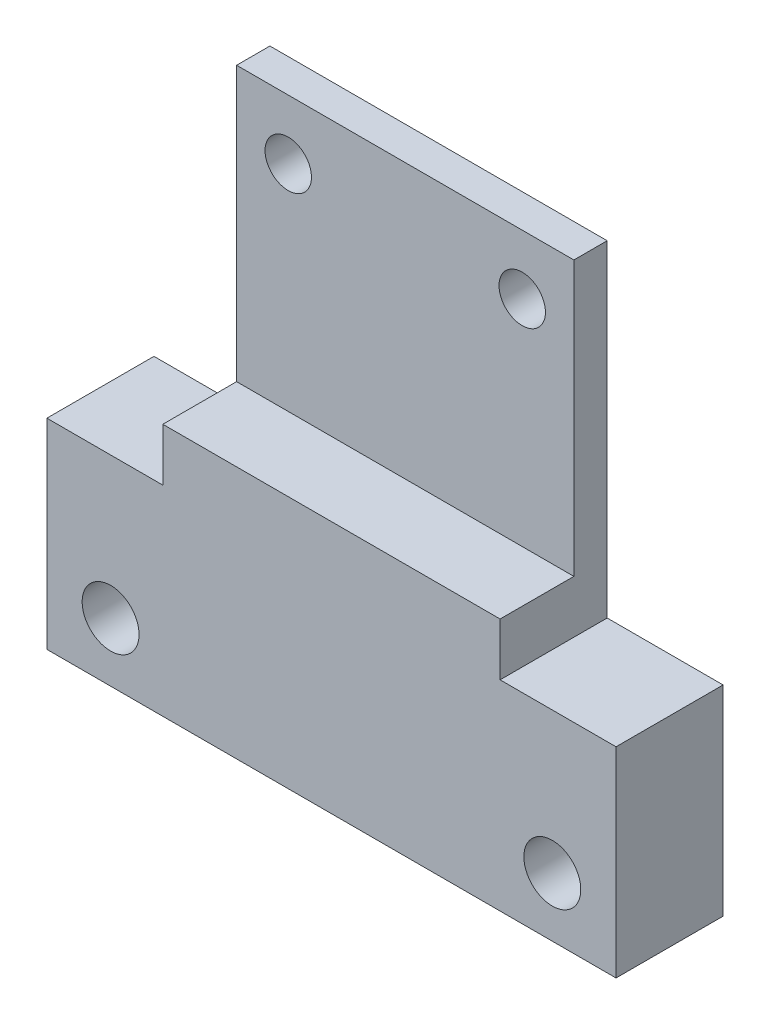
ISO-10303-21;
HEADER;
FILE_DESCRIPTION(('STEP AP214'),'2;1');
FILE_NAME('part.step','',(''),(''),'','','');
FILE_SCHEMA(('AUTOMOTIVE_DESIGN { 1 0 10303 214 1 1 1 1 }'));
ENDSEC;
DATA;
#1=APPLICATION_CONTEXT('core data for automotive mechanical design processes');
#2=APPLICATION_PROTOCOL_DEFINITION('international standard','automotive_design',2000,#1);
#3=PRODUCT_CONTEXT('',#1,'mechanical');
#4=PRODUCT('Part','Part','',(#3));
#5=PRODUCT_RELATED_PRODUCT_CATEGORY('part','',(#4));
#6=PRODUCT_DEFINITION_FORMATION('','',#4);
#7=PRODUCT_DEFINITION_CONTEXT('part definition',#1,'design');
#8=PRODUCT_DEFINITION('design','',#6,#7);
#9=PRODUCT_DEFINITION_SHAPE('','',#8);
#10=(LENGTH_UNIT() NAMED_UNIT(*) SI_UNIT(.MILLI.,.METRE.));
#11=(NAMED_UNIT(*) PLANE_ANGLE_UNIT() SI_UNIT($,.RADIAN.));
#12=(NAMED_UNIT(*) SI_UNIT($,.STERADIAN.) SOLID_ANGLE_UNIT());
#13=UNCERTAINTY_MEASURE_WITH_UNIT(LENGTH_MEASURE(1.E-05),#10,'distance_accuracy_value','');
#14=(GEOMETRIC_REPRESENTATION_CONTEXT(3) GLOBAL_UNCERTAINTY_ASSIGNED_CONTEXT((#13)) GLOBAL_UNIT_ASSIGNED_CONTEXT((#10,
#11,#12)) REPRESENTATION_CONTEXT('',''));
#15=CARTESIAN_POINT('',(0.,0.,0.));
#16=DIRECTION('',(0.,0.,1.));
#17=DIRECTION('',(1.,0.,0.));
#18=AXIS2_PLACEMENT_3D('',#15,#16,#17);
#19=CARTESIAN_POINT('',(5.5,25.,5.08));
#20=DIRECTION('',(0.,-1.,0.));
#21=DIRECTION('',(0.,0.,-1.));
#22=AXIS2_PLACEMENT_3D('',#19,#20,#21);
#23=PLANE('',#22);
#24=DIRECTION('',(-1.,0.,0.));
#25=VECTOR('',#24,1.);
#26=CARTESIAN_POINT('',(5.5,25.,1.58));
#27=LINE('',#26,#25);
#28=CARTESIAN_POINT('',(21.5,25.,1.58));
#29=VERTEX_POINT('',#28);
#30=CARTESIAN_POINT('',(5.5,25.,1.58));
#31=VERTEX_POINT('',#30);
#32=EDGE_CURVE('E218',#29,#31,#27,.T.);
#33=ORIENTED_EDGE('',*,*,#32,.F.);
#34=DIRECTION('',(0.,0.,-1.));
#35=VECTOR('',#34,1.);
#36=CARTESIAN_POINT('',(21.5,25.,5.08));
#37=LINE('',#36,#35);
#38=CARTESIAN_POINT('',(21.5,25.,0.));
#39=VERTEX_POINT('',#38);
#40=EDGE_CURVE('E131',#29,#39,#37,.T.);
#41=ORIENTED_EDGE('',*,*,#40,.T.);
#42=DIRECTION('',(-1.,0.,0.));
#43=VECTOR('',#42,1.);
#44=CARTESIAN_POINT('',(5.5,25.,0.));
#45=LINE('',#44,#43);
#46=CARTESIAN_POINT('',(5.5,25.,0.));
#47=VERTEX_POINT('',#46);
#48=EDGE_CURVE('E155',#39,#47,#45,.T.);
#49=ORIENTED_EDGE('',*,*,#48,.T.);
#50=DIRECTION('',(0.,0.,-1.));
#51=VECTOR('',#50,1.);
#52=CARTESIAN_POINT('',(5.5,25.,5.08));
#53=LINE('',#52,#51);
#54=EDGE_CURVE('E165',#31,#47,#53,.T.);
#55=ORIENTED_EDGE('',*,*,#54,.F.);
#56=EDGE_LOOP('',(#33,#41,#49,#55));
#57=FACE_BOUND('',#56,.T.);
#58=ADVANCED_FACE('F33',(#57),#23,.F.);
#59=CARTESIAN_POINT('',(0.,0.,5.08));
#60=DIRECTION('',(1.,0.,0.));
#61=DIRECTION('',(0.,0.,-1.));
#62=AXIS2_PLACEMENT_3D('',#59,#60,#61);
#63=PLANE('',#62);
#64=DIRECTION('',(0.,-1.,0.));
#65=VECTOR('',#64,1.);
#66=CARTESIAN_POINT('',(0.,0.,0.));
#67=LINE('',#66,#65);
#68=CARTESIAN_POINT('',(0.,9.5,0.));
#69=VERTEX_POINT('',#68);
#70=CARTESIAN_POINT('',(0.,0.,0.));
#71=VERTEX_POINT('',#70);
#72=EDGE_CURVE('E145',#69,#71,#67,.T.);
#73=ORIENTED_EDGE('',*,*,#72,.T.);
#74=DIRECTION('',(0.,0.,-1.));
#75=VECTOR('',#74,1.);
#76=CARTESIAN_POINT('',(0.,0.,5.08));
#77=LINE('',#76,#75);
#78=CARTESIAN_POINT('',(0.,0.,5.08));
#79=VERTEX_POINT('',#78);
#80=EDGE_CURVE('E11',#79,#71,#77,.T.);
#81=ORIENTED_EDGE('',*,*,#80,.F.);
#82=DIRECTION('',(0.,-1.,0.));
#83=VECTOR('',#82,1.);
#84=CARTESIAN_POINT('',(0.,0.,5.08));
#85=LINE('',#84,#83);
#86=CARTESIAN_POINT('',(0.,9.5,5.08));
#87=VERTEX_POINT('',#86);
#88=EDGE_CURVE('E161',#87,#79,#85,.T.);
#89=ORIENTED_EDGE('',*,*,#88,.F.);
#90=DIRECTION('',(0.,0.,-1.));
#91=VECTOR('',#90,1.);
#92=CARTESIAN_POINT('',(0.,9.5,5.08));
#93=LINE('',#92,#91);
#94=EDGE_CURVE('E144',#87,#69,#93,.T.);
#95=ORIENTED_EDGE('',*,*,#94,.T.);
#96=EDGE_LOOP('',(#73,#81,#89,#95));
#97=FACE_BOUND('',#96,.T.);
#98=ADVANCED_FACE('F35',(#97),#63,.F.);
#99=CARTESIAN_POINT('',(0.,0.,5.08));
#100=DIRECTION('',(0.,1.,0.));
#101=DIRECTION('',(0.,0.,1.));
#102=AXIS2_PLACEMENT_3D('',#99,#100,#101);
#103=PLANE('',#102);
#104=DIRECTION('',(1.,0.,0.));
#105=VECTOR('',#104,1.);
#106=CARTESIAN_POINT('',(0.,0.,0.));
#107=LINE('',#106,#105);
#108=CARTESIAN_POINT('',(27.,0.,0.));
#109=VERTEX_POINT('',#108);
#110=EDGE_CURVE('E148',#71,#109,#107,.T.);
#111=ORIENTED_EDGE('',*,*,#110,.T.);
#112=DIRECTION('',(0.,0.,-1.));
#113=VECTOR('',#112,1.);
#114=CARTESIAN_POINT('',(27.,0.,5.08));
#115=LINE('',#114,#113);
#116=CARTESIAN_POINT('',(27.,0.,5.08));
#117=VERTEX_POINT('',#116);
#118=EDGE_CURVE('E42',#117,#109,#115,.T.);
#119=ORIENTED_EDGE('',*,*,#118,.F.);
#120=DIRECTION('',(1.,0.,0.));
#121=VECTOR('',#120,1.);
#122=CARTESIAN_POINT('',(0.,0.,5.08));
#123=LINE('',#122,#121);
#124=EDGE_CURVE('E100',#79,#117,#123,.T.);
#125=ORIENTED_EDGE('',*,*,#124,.F.);
#126=ORIENTED_EDGE('',*,*,#80,.T.);
#127=EDGE_LOOP('',(#111,#119,#125,#126));
#128=FACE_BOUND('',#127,.T.);
#129=ADVANCED_FACE('F227',(#128),#103,.F.);
#130=CARTESIAN_POINT('',(27.,0.,5.08));
#131=DIRECTION('',(-1.,0.,0.));
#132=DIRECTION('',(0.,0.,1.));
#133=AXIS2_PLACEMENT_3D('',#130,#131,#132);
#134=PLANE('',#133);
#135=DIRECTION('',(0.,1.,0.));
#136=VECTOR('',#135,1.);
#137=CARTESIAN_POINT('',(27.,0.,0.));
#138=LINE('',#137,#136);
#139=CARTESIAN_POINT('',(27.,9.5,0.));
#140=VERTEX_POINT('',#139);
#141=EDGE_CURVE('E150',#109,#140,#138,.T.);
#142=ORIENTED_EDGE('',*,*,#141,.T.);
#143=DIRECTION('',(0.,0.,-1.));
#144=VECTOR('',#143,1.);
#145=CARTESIAN_POINT('',(27.,9.5,5.08));
#146=LINE('',#145,#144);
#147=CARTESIAN_POINT('',(27.,9.5,5.08));
#148=VERTEX_POINT('',#147);
#149=EDGE_CURVE('E130',#148,#140,#146,.T.);
#150=ORIENTED_EDGE('',*,*,#149,.F.);
#151=DIRECTION('',(0.,1.,0.));
#152=VECTOR('',#151,1.);
#153=CARTESIAN_POINT('',(27.,0.,5.08));
#154=LINE('',#153,#152);
#155=EDGE_CURVE('E117',#117,#148,#154,.T.);
#156=ORIENTED_EDGE('',*,*,#155,.F.);
#157=ORIENTED_EDGE('',*,*,#118,.T.);
#158=EDGE_LOOP('',(#142,#150,#156,#157));
#159=FACE_BOUND('',#158,.T.);
#160=ADVANCED_FACE('F230',(#159),#134,.F.);
#161=CARTESIAN_POINT('',(21.5,9.5,5.08));
#162=DIRECTION('',(0.,-1.,0.));
#163=DIRECTION('',(0.,0.,-1.));
#164=AXIS2_PLACEMENT_3D('',#161,#162,#163);
#165=PLANE('',#164);
#166=DIRECTION('',(-1.,0.,0.));
#167=VECTOR('',#166,1.);
#168=CARTESIAN_POINT('',(21.5,9.5,0.));
#169=LINE('',#168,#167);
#170=CARTESIAN_POINT('',(21.5,9.5,0.));
#171=VERTEX_POINT('',#170);
#172=EDGE_CURVE('E126',#140,#171,#169,.T.);
#173=ORIENTED_EDGE('',*,*,#172,.T.);
#174=DIRECTION('',(0.,0.,-1.));
#175=VECTOR('',#174,1.);
#176=CARTESIAN_POINT('',(21.5,9.5,5.08));
#177=LINE('',#176,#175);
#178=CARTESIAN_POINT('',(21.5,9.5,5.08));
#179=VERTEX_POINT('',#178);
#180=EDGE_CURVE('E123',#179,#171,#177,.T.);
#181=ORIENTED_EDGE('',*,*,#180,.F.);
#182=DIRECTION('',(-1.,0.,0.));
#183=VECTOR('',#182,1.);
#184=CARTESIAN_POINT('',(21.5,9.5,5.08));
#185=LINE('',#184,#183);
#186=EDGE_CURVE('E111',#148,#179,#185,.T.);
#187=ORIENTED_EDGE('',*,*,#186,.F.);
#188=ORIENTED_EDGE('',*,*,#149,.T.);
#189=EDGE_LOOP('',(#173,#181,#187,#188));
#190=FACE_BOUND('',#189,.T.);
#191=ADVANCED_FACE('F124',(#190),#165,.F.);
#192=CARTESIAN_POINT('',(21.5,25.,5.08));
#193=DIRECTION('',(-1.,0.,0.));
#194=DIRECTION('',(0.,-1.,0.));
#195=AXIS2_PLACEMENT_3D('',#192,#193,#194);
#196=PLANE('',#195);
#197=DIRECTION('',(0.,1.,0.));
#198=VECTOR('',#197,1.);
#199=CARTESIAN_POINT('',(21.5,25.,1.58));
#200=LINE('',#199,#198);
#201=CARTESIAN_POINT('',(21.5,12.,1.58));
#202=VERTEX_POINT('',#201);
#203=EDGE_CURVE('E215',#202,#29,#200,.T.);
#204=ORIENTED_EDGE('',*,*,#203,.F.);
#205=DIRECTION('',(0.,0.,1.));
#206=VECTOR('',#205,1.);
#207=CARTESIAN_POINT('',(21.5,12.,1.58));
#208=LINE('',#207,#206);
#209=CARTESIAN_POINT('',(21.5,12.,5.08));
#210=VERTEX_POINT('',#209);
#211=EDGE_CURVE('E137',#202,#210,#208,.T.);
#212=ORIENTED_EDGE('',*,*,#211,.T.);
#213=DIRECTION('',(0.,1.,0.));
#214=VECTOR('',#213,1.);
#215=CARTESIAN_POINT('',(21.5,25.,5.08));
#216=LINE('',#215,#214);
#217=EDGE_CURVE('E115',#179,#210,#216,.T.);
#218=ORIENTED_EDGE('',*,*,#217,.F.);
#219=ORIENTED_EDGE('',*,*,#180,.T.);
#220=DIRECTION('',(0.,1.,0.));
#221=VECTOR('',#220,1.);
#222=CARTESIAN_POINT('',(21.5,25.,0.));
#223=LINE('',#222,#221);
#224=EDGE_CURVE('E153',#171,#39,#223,.T.);
#225=ORIENTED_EDGE('',*,*,#224,.T.);
#226=ORIENTED_EDGE('',*,*,#40,.F.);
#227=EDGE_LOOP('',(#204,#212,#218,#219,#225,#226));
#228=FACE_BOUND('',#227,.T.);
#229=ADVANCED_FACE('F135',(#228),#196,.F.);
#230=CARTESIAN_POINT('',(5.5,25.,5.08));
#231=DIRECTION('',(1.,0.,0.));
#232=DIRECTION('',(0.,1.,0.));
#233=AXIS2_PLACEMENT_3D('',#230,#231,#232);
#234=PLANE('',#233);
#235=DIRECTION('',(0.,-1.,0.));
#236=VECTOR('',#235,1.);
#237=CARTESIAN_POINT('',(5.5,25.,5.08));
#238=LINE('',#237,#236);
#239=CARTESIAN_POINT('',(5.5,12.,5.08));
#240=VERTEX_POINT('',#239);
#241=CARTESIAN_POINT('',(5.5,9.5,5.08));
#242=VERTEX_POINT('',#241);
#243=EDGE_CURVE('E138',#240,#242,#238,.T.);
#244=ORIENTED_EDGE('',*,*,#243,.F.);
#245=DIRECTION('',(0.,0.,1.));
#246=VECTOR('',#245,1.);
#247=CARTESIAN_POINT('',(5.5,12.,1.58));
#248=LINE('',#247,#246);
#249=CARTESIAN_POINT('',(5.5,12.,1.58));
#250=VERTEX_POINT('',#249);
#251=EDGE_CURVE('E50',#250,#240,#248,.T.);
#252=ORIENTED_EDGE('',*,*,#251,.F.);
#253=DIRECTION('',(0.,-1.,0.));
#254=VECTOR('',#253,1.);
#255=CARTESIAN_POINT('',(5.5,25.,1.58));
#256=LINE('',#255,#254);
#257=EDGE_CURVE('E209',#31,#250,#256,.T.);
#258=ORIENTED_EDGE('',*,*,#257,.F.);
#259=ORIENTED_EDGE('',*,*,#54,.T.);
#260=DIRECTION('',(0.,-1.,0.));
#261=VECTOR('',#260,1.);
#262=CARTESIAN_POINT('',(5.5,25.,0.));
#263=LINE('',#262,#261);
#264=CARTESIAN_POINT('',(5.5,9.5,0.));
#265=VERTEX_POINT('',#264);
#266=EDGE_CURVE('E158',#47,#265,#263,.T.);
#267=ORIENTED_EDGE('',*,*,#266,.T.);
#268=DIRECTION('',(0.,0.,-1.));
#269=VECTOR('',#268,1.);
#270=CARTESIAN_POINT('',(5.5,9.5,5.08));
#271=LINE('',#270,#269);
#272=EDGE_CURVE('E163',#242,#265,#271,.T.);
#273=ORIENTED_EDGE('',*,*,#272,.F.);
#274=EDGE_LOOP('',(#244,#252,#258,#259,#267,#273));
#275=FACE_BOUND('',#274,.T.);
#276=ADVANCED_FACE('F249',(#275),#234,.F.);
#277=CARTESIAN_POINT('',(0.,9.5,5.08));
#278=DIRECTION('',(0.,-1.,0.));
#279=DIRECTION('',(0.,0.,-1.));
#280=AXIS2_PLACEMENT_3D('',#277,#278,#279);
#281=PLANE('',#280);
#282=DIRECTION('',(-1.,0.,0.));
#283=VECTOR('',#282,1.);
#284=CARTESIAN_POINT('',(0.,9.5,0.));
#285=LINE('',#284,#283);
#286=EDGE_CURVE('E92',#265,#69,#285,.T.);
#287=ORIENTED_EDGE('',*,*,#286,.T.);
#288=ORIENTED_EDGE('',*,*,#94,.F.);
#289=DIRECTION('',(-1.,0.,0.));
#290=VECTOR('',#289,1.);
#291=CARTESIAN_POINT('',(0.,9.5,5.08));
#292=LINE('',#291,#290);
#293=EDGE_CURVE('E59',#242,#87,#292,.T.);
#294=ORIENTED_EDGE('',*,*,#293,.F.);
#295=ORIENTED_EDGE('',*,*,#272,.T.);
#296=EDGE_LOOP('',(#287,#288,#294,#295));
#297=FACE_BOUND('',#296,.T.);
#298=ADVANCED_FACE('F254',(#297),#281,.F.);
#299=CARTESIAN_POINT('',(0.,0.,5.08));
#300=DIRECTION('',(0.,0.,-1.));
#301=DIRECTION('',(-1.,0.,0.));
#302=AXIS2_PLACEMENT_3D('',#299,#300,#301);
#303=PLANE('',#302);
#304=CARTESIAN_POINT('',(23.9775,2.794,5.08));
#305=DIRECTION('',(0.,0.,-1.));
#306=DIRECTION('',(-1.,0.,0.));
#307=AXIS2_PLACEMENT_3D('',#304,#305,#306);
#308=CIRCLE('',#307,1.35);
#309=CARTESIAN_POINT('',(22.6275,2.794,5.08));
#310=VERTEX_POINT('',#309);
#311=EDGE_CURVE('E37',#310,#310,#308,.T.);
#312=ORIENTED_EDGE('',*,*,#311,.T.);
#313=EDGE_LOOP('',(#312));
#314=FACE_BOUND('',#313,.T.);
#315=CARTESIAN_POINT('',(3.0225,2.794,5.08));
#316=DIRECTION('',(0.,0.,-1.));
#317=DIRECTION('',(-1.,0.,0.));
#318=AXIS2_PLACEMENT_3D('',#315,#316,#317);
#319=CIRCLE('',#318,1.35);
#320=CARTESIAN_POINT('',(1.6725,2.794,5.08));
#321=VERTEX_POINT('',#320);
#322=EDGE_CURVE('E178',#321,#321,#319,.T.);
#323=ORIENTED_EDGE('',*,*,#322,.T.);
#324=EDGE_LOOP('',(#323));
#325=FACE_BOUND('',#324,.T.);
#326=ORIENTED_EDGE('',*,*,#217,.T.);
#327=DIRECTION('',(1.,0.,0.));
#328=VECTOR('',#327,1.);
#329=CARTESIAN_POINT('',(5.5,12.,5.08));
#330=LINE('',#329,#328);
#331=EDGE_CURVE('E200',#240,#210,#330,.T.);
#332=ORIENTED_EDGE('',*,*,#331,.F.);
#333=ORIENTED_EDGE('',*,*,#243,.T.);
#334=ORIENTED_EDGE('',*,*,#293,.T.);
#335=ORIENTED_EDGE('',*,*,#88,.T.);
#336=ORIENTED_EDGE('',*,*,#124,.T.);
#337=ORIENTED_EDGE('',*,*,#155,.T.);
#338=ORIENTED_EDGE('',*,*,#186,.T.);
#339=EDGE_LOOP('',(#326,#332,#333,#334,#335,#336,#337,#338));
#340=FACE_BOUND('',#339,.T.);
#341=ADVANCED_FACE('F113',(#314,#325,#340),#303,.F.);
#342=CARTESIAN_POINT('',(0.,0.,0.));
#343=DIRECTION('',(0.,0.,-1.));
#344=DIRECTION('',(-1.,0.,0.));
#345=AXIS2_PLACEMENT_3D('',#342,#343,#344);
#346=PLANE('',#345);
#347=CARTESIAN_POINT('',(19.0499,22.1742,0.));
#348=DIRECTION('',(0.,0.,-1.));
#349=DIRECTION('',(-1.,0.,0.));
#350=AXIS2_PLACEMENT_3D('',#347,#348,#349);
#351=CIRCLE('',#350,1.1);
#352=CARTESIAN_POINT('',(17.9499,22.1742,0.));
#353=VERTEX_POINT('',#352);
#354=EDGE_CURVE('E175',#353,#353,#351,.T.);
#355=ORIENTED_EDGE('',*,*,#354,.F.);
#356=EDGE_LOOP('',(#355));
#357=FACE_BOUND('',#356,.T.);
#358=CARTESIAN_POINT('',(7.9501,22.1742,0.));
#359=DIRECTION('',(0.,0.,-1.));
#360=DIRECTION('',(-1.,0.,0.));
#361=AXIS2_PLACEMENT_3D('',#358,#359,#360);
#362=CIRCLE('',#361,1.1);
#363=CARTESIAN_POINT('',(6.8501,22.1742,0.));
#364=VERTEX_POINT('',#363);
#365=EDGE_CURVE('E184',#364,#364,#362,.T.);
#366=ORIENTED_EDGE('',*,*,#365,.F.);
#367=EDGE_LOOP('',(#366));
#368=FACE_BOUND('',#367,.T.);
#369=CARTESIAN_POINT('',(23.9775,2.794,0.));
#370=DIRECTION('',(0.,0.,-1.));
#371=DIRECTION('',(-1.,0.,0.));
#372=AXIS2_PLACEMENT_3D('',#369,#370,#371);
#373=CIRCLE('',#372,2.);
#374=CARTESIAN_POINT('',(21.9775,2.794,0.));
#375=VERTEX_POINT('',#374);
#376=EDGE_CURVE('E201',#375,#375,#373,.T.);
#377=ORIENTED_EDGE('',*,*,#376,.F.);
#378=EDGE_LOOP('',(#377));
#379=FACE_BOUND('',#378,.T.);
#380=CARTESIAN_POINT('',(3.0225,2.794,0.));
#381=DIRECTION('',(0.,0.,-1.));
#382=DIRECTION('',(-1.,0.,0.));
#383=AXIS2_PLACEMENT_3D('',#380,#381,#382);
#384=CIRCLE('',#383,2.);
#385=CARTESIAN_POINT('',(1.0225,2.794,0.));
#386=VERTEX_POINT('',#385);
#387=EDGE_CURVE('E177',#386,#386,#384,.T.);
#388=ORIENTED_EDGE('',*,*,#387,.F.);
#389=EDGE_LOOP('',(#388));
#390=FACE_BOUND('',#389,.T.);
#391=ORIENTED_EDGE('',*,*,#72,.F.);
#392=ORIENTED_EDGE('',*,*,#286,.F.);
#393=ORIENTED_EDGE('',*,*,#266,.F.);
#394=ORIENTED_EDGE('',*,*,#48,.F.);
#395=ORIENTED_EDGE('',*,*,#224,.F.);
#396=ORIENTED_EDGE('',*,*,#172,.F.);
#397=ORIENTED_EDGE('',*,*,#141,.F.);
#398=ORIENTED_EDGE('',*,*,#110,.F.);
#399=EDGE_LOOP('',(#391,#392,#393,#394,#395,#396,#397,#398));
#400=FACE_BOUND('',#399,.T.);
#401=ADVANCED_FACE('F233',(#357,#368,#379,#390,#400),#346,.T.);
#402=CARTESIAN_POINT('',(5.5,12.,1.58));
#403=DIRECTION('',(0.,-1.,0.));
#404=DIRECTION('',(0.,0.,-1.));
#405=AXIS2_PLACEMENT_3D('',#402,#403,#404);
#406=PLANE('',#405);
#407=ORIENTED_EDGE('',*,*,#331,.T.);
#408=ORIENTED_EDGE('',*,*,#211,.F.);
#409=DIRECTION('',(1.,0.,0.));
#410=VECTOR('',#409,1.);
#411=CARTESIAN_POINT('',(5.5,12.,1.58));
#412=LINE('',#411,#410);
#413=EDGE_CURVE('E212',#250,#202,#412,.T.);
#414=ORIENTED_EDGE('',*,*,#413,.F.);
#415=ORIENTED_EDGE('',*,*,#251,.T.);
#416=EDGE_LOOP('',(#407,#408,#414,#415));
#417=FACE_BOUND('',#416,.T.);
#418=ADVANCED_FACE('F253',(#417),#406,.F.);
#419=CARTESIAN_POINT('',(0.,0.,1.58));
#420=DIRECTION('',(0.,0.,1.));
#421=DIRECTION('',(1.,0.,0.));
#422=AXIS2_PLACEMENT_3D('',#419,#420,#421);
#423=PLANE('',#422);
#424=CARTESIAN_POINT('',(19.0499,22.1742,1.58));
#425=DIRECTION('',(0.,0.,1.));
#426=DIRECTION('',(1.,0.,0.));
#427=AXIS2_PLACEMENT_3D('',#424,#425,#426);
#428=CIRCLE('',#427,1.1);
#429=CARTESIAN_POINT('',(20.1499,22.1742,1.58));
#430=VERTEX_POINT('',#429);
#431=EDGE_CURVE('E174',#430,#430,#428,.T.);
#432=ORIENTED_EDGE('',*,*,#431,.F.);
#433=EDGE_LOOP('',(#432));
#434=FACE_BOUND('',#433,.T.);
#435=CARTESIAN_POINT('',(7.9501,22.1742,1.58));
#436=DIRECTION('',(0.,0.,1.));
#437=DIRECTION('',(1.,0.,0.));
#438=AXIS2_PLACEMENT_3D('',#435,#436,#437);
#439=CIRCLE('',#438,1.1);
#440=CARTESIAN_POINT('',(9.0501,22.1742,1.58));
#441=VERTEX_POINT('',#440);
#442=EDGE_CURVE('E171',#441,#441,#439,.T.);
#443=ORIENTED_EDGE('',*,*,#442,.F.);
#444=EDGE_LOOP('',(#443));
#445=FACE_BOUND('',#444,.T.);
#446=ORIENTED_EDGE('',*,*,#257,.T.);
#447=ORIENTED_EDGE('',*,*,#413,.T.);
#448=ORIENTED_EDGE('',*,*,#203,.T.);
#449=ORIENTED_EDGE('',*,*,#32,.T.);
#450=EDGE_LOOP('',(#446,#447,#448,#449));
#451=FACE_BOUND('',#450,.T.);
#452=ADVANCED_FACE('F245',(#434,#445,#451),#423,.T.);
#453=CARTESIAN_POINT('',(3.0225,2.794,3.));
#454=DIRECTION('',(0.,0.,-1.));
#455=DIRECTION('',(-1.,0.,0.));
#456=AXIS2_PLACEMENT_3D('',#453,#454,#455);
#457=CYLINDRICAL_SURFACE('',#456,2.);
#458=CARTESIAN_POINT('',(3.0225,2.794,3.));
#459=DIRECTION('',(0.,0.,-1.));
#460=DIRECTION('',(-1.,0.,0.));
#461=AXIS2_PLACEMENT_3D('',#458,#459,#460);
#462=CIRCLE('',#461,2.);
#463=CARTESIAN_POINT('',(1.0225,2.794,3.));
#464=VERTEX_POINT('',#463);
#465=EDGE_CURVE('E204',#464,#464,#462,.T.);
#466=ORIENTED_EDGE('',*,*,#465,.F.);
#467=EDGE_LOOP('',(#466));
#468=FACE_BOUND('',#467,.T.);
#469=ORIENTED_EDGE('',*,*,#387,.T.);
#470=EDGE_LOOP('',(#469));
#471=FACE_BOUND('',#470,.T.);
#472=ADVANCED_FACE('F330',(#468,#471),#457,.F.);
#473=CARTESIAN_POINT('',(3.0225,2.794,3.));
#474=DIRECTION('',(0.,0.,-1.));
#475=DIRECTION('',(-1.,0.,0.));
#476=AXIS2_PLACEMENT_3D('',#473,#474,#475);
#477=PLANE('',#476);
#478=CARTESIAN_POINT('',(3.0225,2.794,3.));
#479=DIRECTION('',(0.,0.,-1.));
#480=DIRECTION('',(-1.,0.,0.));
#481=AXIS2_PLACEMENT_3D('',#478,#479,#480);
#482=CIRCLE('',#481,1.35);
#483=CARTESIAN_POINT('',(1.6725,2.794,3.));
#484=VERTEX_POINT('',#483);
#485=EDGE_CURVE('E186',#484,#484,#482,.T.);
#486=ORIENTED_EDGE('',*,*,#485,.F.);
#487=EDGE_LOOP('',(#486));
#488=FACE_BOUND('',#487,.T.);
#489=ORIENTED_EDGE('',*,*,#465,.T.);
#490=EDGE_LOOP('',(#489));
#491=FACE_BOUND('',#490,.T.);
#492=ADVANCED_FACE('F340',(#488,#491),#477,.T.);
#493=CARTESIAN_POINT('',(23.9775,2.794,3.));
#494=DIRECTION('',(0.,0.,-1.));
#495=DIRECTION('',(-1.,0.,0.));
#496=AXIS2_PLACEMENT_3D('',#493,#494,#495);
#497=CYLINDRICAL_SURFACE('',#496,2.);
#498=CARTESIAN_POINT('',(23.9775,2.794,3.));
#499=DIRECTION('',(0.,0.,-1.));
#500=DIRECTION('',(-1.,0.,0.));
#501=AXIS2_PLACEMENT_3D('',#498,#499,#500);
#502=CIRCLE('',#501,2.);
#503=CARTESIAN_POINT('',(21.9775,2.794,3.));
#504=VERTEX_POINT('',#503);
#505=EDGE_CURVE('E197',#504,#504,#502,.T.);
#506=ORIENTED_EDGE('',*,*,#505,.F.);
#507=EDGE_LOOP('',(#506));
#508=FACE_BOUND('',#507,.T.);
#509=ORIENTED_EDGE('',*,*,#376,.T.);
#510=EDGE_LOOP('',(#509));
#511=FACE_BOUND('',#510,.T.);
#512=ADVANCED_FACE('F346',(#508,#511),#497,.F.);
#513=CARTESIAN_POINT('',(23.9775,2.794,3.));
#514=DIRECTION('',(0.,0.,-1.));
#515=DIRECTION('',(-1.,0.,0.));
#516=AXIS2_PLACEMENT_3D('',#513,#514,#515);
#517=PLANE('',#516);
#518=CARTESIAN_POINT('',(23.9775,2.794,3.));
#519=DIRECTION('',(0.,0.,-1.));
#520=DIRECTION('',(-1.,0.,0.));
#521=AXIS2_PLACEMENT_3D('',#518,#519,#520);
#522=CIRCLE('',#521,1.35);
#523=CARTESIAN_POINT('',(22.6275,2.794,3.));
#524=VERTEX_POINT('',#523);
#525=EDGE_CURVE('E180',#524,#524,#522,.T.);
#526=ORIENTED_EDGE('',*,*,#525,.F.);
#527=EDGE_LOOP('',(#526));
#528=FACE_BOUND('',#527,.T.);
#529=ORIENTED_EDGE('',*,*,#505,.T.);
#530=EDGE_LOOP('',(#529));
#531=FACE_BOUND('',#530,.T.);
#532=ADVANCED_FACE('F354',(#528,#531),#517,.T.);
#533=CARTESIAN_POINT('',(7.9501,22.1742,21.));
#534=DIRECTION('',(0.,0.,-1.));
#535=DIRECTION('',(-1.,0.,0.));
#536=AXIS2_PLACEMENT_3D('',#533,#534,#535);
#537=CYLINDRICAL_SURFACE('',#536,1.1);
#538=ORIENTED_EDGE('',*,*,#442,.T.);
#539=EDGE_LOOP('',(#538));
#540=FACE_BOUND('',#539,.T.);
#541=ORIENTED_EDGE('',*,*,#365,.T.);
#542=EDGE_LOOP('',(#541));
#543=FACE_BOUND('',#542,.T.);
#544=ADVANCED_FACE('F361',(#540,#543),#537,.F.);
#545=CARTESIAN_POINT('',(19.0499,22.1742,21.));
#546=DIRECTION('',(0.,0.,-1.));
#547=DIRECTION('',(-1.,0.,0.));
#548=AXIS2_PLACEMENT_3D('',#545,#546,#547);
#549=CYLINDRICAL_SURFACE('',#548,1.1);
#550=ORIENTED_EDGE('',*,*,#431,.T.);
#551=EDGE_LOOP('',(#550));
#552=FACE_BOUND('',#551,.T.);
#553=ORIENTED_EDGE('',*,*,#354,.T.);
#554=EDGE_LOOP('',(#553));
#555=FACE_BOUND('',#554,.T.);
#556=ADVANCED_FACE('F369',(#552,#555),#549,.F.);
#557=CARTESIAN_POINT('',(3.0225,2.794,24.));
#558=DIRECTION('',(0.,0.,-1.));
#559=DIRECTION('',(-1.,0.,0.));
#560=AXIS2_PLACEMENT_3D('',#557,#558,#559);
#561=CYLINDRICAL_SURFACE('',#560,1.35);
#562=ORIENTED_EDGE('',*,*,#485,.T.);
#563=EDGE_LOOP('',(#562));
#564=FACE_BOUND('',#563,.T.);
#565=ORIENTED_EDGE('',*,*,#322,.F.);
#566=EDGE_LOOP('',(#565));
#567=FACE_BOUND('',#566,.T.);
#568=ADVANCED_FACE('F376',(#564,#567),#561,.F.);
#569=CARTESIAN_POINT('',(23.9775,2.794,24.));
#570=DIRECTION('',(0.,0.,-1.));
#571=DIRECTION('',(-1.,0.,0.));
#572=AXIS2_PLACEMENT_3D('',#569,#570,#571);
#573=CYLINDRICAL_SURFACE('',#572,1.35);
#574=ORIENTED_EDGE('',*,*,#525,.T.);
#575=EDGE_LOOP('',(#574));
#576=FACE_BOUND('',#575,.T.);
#577=ORIENTED_EDGE('',*,*,#311,.F.);
#578=EDGE_LOOP('',(#577));
#579=FACE_BOUND('',#578,.T.);
#580=ADVANCED_FACE('F383',(#576,#579),#573,.F.);
#581=CLOSED_SHELL('',(#58,#98,#129,#160,#191,#229,#276,#298,#341,#401,#418,#452,#472,#492,#512,
#532,#544,#556,#568,#580));
#582=MANIFOLD_SOLID_BREP('B2',#581);
#583=ADVANCED_BREP_SHAPE_REPRESENTATION('',(#18,#582),#14);
#584=SHAPE_DEFINITION_REPRESENTATION(#9,#583);
ENDSEC;
END-ISO-10303-21;
